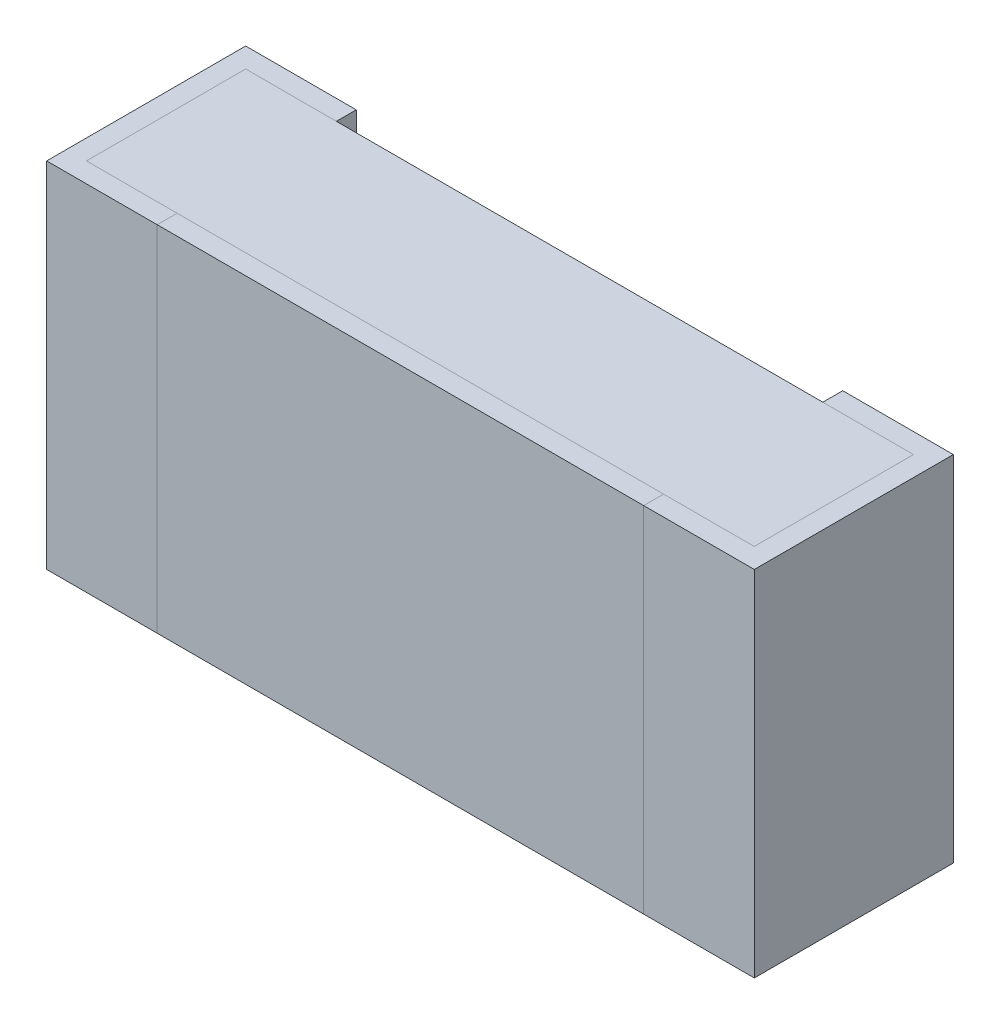
ISO-10303-21;
HEADER;
FILE_DESCRIPTION(('STEP AP214'),'2;1');
FILE_NAME('part.step','',(''),(''),'','','');
FILE_SCHEMA(('AUTOMOTIVE_DESIGN { 1 0 10303 214 1 1 1 1 }'));
ENDSEC;
DATA;
#1=APPLICATION_CONTEXT('core data for automotive mechanical design processes');
#2=APPLICATION_PROTOCOL_DEFINITION('international standard','automotive_design',2000,#1);
#3=PRODUCT_CONTEXT('',#1,'mechanical');
#4=PRODUCT('Part','Part','',(#3));
#5=PRODUCT_RELATED_PRODUCT_CATEGORY('part','',(#4));
#6=PRODUCT_DEFINITION_FORMATION('','',#4);
#7=PRODUCT_DEFINITION_CONTEXT('part definition',#1,'design');
#8=PRODUCT_DEFINITION('design','',#6,#7);
#9=PRODUCT_DEFINITION_SHAPE('','',#8);
#10=(LENGTH_UNIT() NAMED_UNIT(*) SI_UNIT(.MILLI.,.METRE.));
#11=(NAMED_UNIT(*) PLANE_ANGLE_UNIT() SI_UNIT($,.RADIAN.));
#12=(NAMED_UNIT(*) SI_UNIT($,.STERADIAN.) SOLID_ANGLE_UNIT());
#13=UNCERTAINTY_MEASURE_WITH_UNIT(LENGTH_MEASURE(1.E-05),#10,'distance_accuracy_value','');
#14=(GEOMETRIC_REPRESENTATION_CONTEXT(3) GLOBAL_UNCERTAINTY_ASSIGNED_CONTEXT((#13)) GLOBAL_UNIT_ASSIGNED_CONTEXT((#10,
#11,#12)) REPRESENTATION_CONTEXT('',''));
#15=CARTESIAN_POINT('',(0.,0.,0.));
#16=DIRECTION('',(0.,0.,1.));
#17=DIRECTION('',(1.,0.,0.));
#18=AXIS2_PLACEMENT_3D('',#15,#16,#17);
#19=CARTESIAN_POINT('',(-0.755,-0.4,0.045));
#20=DIRECTION('',(1.,0.,0.));
#21=DIRECTION('',(0.,0.,1.));
#22=AXIS2_PLACEMENT_3D('',#19,#20,#21);
#23=PLANE('',#22);
#24=DIRECTION('',(0.,1.,0.));
#25=VECTOR('',#24,1.);
#26=CARTESIAN_POINT('',(-0.755,-0.4,0.405));
#27=LINE('',#26,#25);
#28=CARTESIAN_POINT('',(-0.755,-0.4,0.405));
#29=VERTEX_POINT('',#28);
#30=CARTESIAN_POINT('',(-0.755,0.4,0.405));
#31=VERTEX_POINT('',#30);
#32=EDGE_CURVE('P0_E11',#29,#31,#27,.T.);
#33=ORIENTED_EDGE('',*,*,#32,.T.);
#34=DIRECTION('',(0.,0.,1.));
#35=VECTOR('',#34,1.);
#36=CARTESIAN_POINT('',(-0.755,0.4,0.045));
#37=LINE('',#36,#35);
#38=CARTESIAN_POINT('',(-0.755,0.4,0.045));
#39=VERTEX_POINT('',#38);
#40=EDGE_CURVE('P0_E24',#39,#31,#37,.T.);
#41=ORIENTED_EDGE('',*,*,#40,.F.);
#42=DIRECTION('',(0.,1.,0.));
#43=VECTOR('',#42,1.);
#44=CARTESIAN_POINT('',(-0.755,-0.4,0.045));
#45=LINE('',#44,#43);
#46=CARTESIAN_POINT('',(-0.755,-0.4,0.045));
#47=VERTEX_POINT('',#46);
#48=EDGE_CURVE('P0_E88',#47,#39,#45,.T.);
#49=ORIENTED_EDGE('',*,*,#48,.F.);
#50=DIRECTION('',(0.,0.,1.));
#51=VECTOR('',#50,1.);
#52=CARTESIAN_POINT('',(-0.755,-0.4,0.045));
#53=LINE('',#52,#51);
#54=EDGE_CURVE('P0_E38',#47,#29,#53,.T.);
#55=ORIENTED_EDGE('',*,*,#54,.T.);
#56=EDGE_LOOP('',(#33,#41,#49,#55));
#57=FACE_BOUND('',#56,.T.);
#58=ADVANCED_FACE('P0_F17',(#57),#23,.F.);
#59=CARTESIAN_POINT('',(0.755,-0.4,0.045));
#60=DIRECTION('',(1.,0.,0.));
#61=DIRECTION('',(0.,0.,1.));
#62=AXIS2_PLACEMENT_3D('',#59,#60,#61);
#63=PLANE('',#62);
#64=DIRECTION('',(0.,0.,1.));
#65=VECTOR('',#64,1.);
#66=CARTESIAN_POINT('',(0.755,-0.4,0.045));
#67=LINE('',#66,#65);
#68=CARTESIAN_POINT('',(0.755,-0.4,0.045));
#69=VERTEX_POINT('',#68);
#70=CARTESIAN_POINT('',(0.755,-0.4,0.405));
#71=VERTEX_POINT('',#70);
#72=EDGE_CURVE('P0_E83',#69,#71,#67,.T.);
#73=ORIENTED_EDGE('',*,*,#72,.F.);
#74=DIRECTION('',(0.,1.,0.));
#75=VECTOR('',#74,1.);
#76=CARTESIAN_POINT('',(0.755,-0.4,0.045));
#77=LINE('',#76,#75);
#78=CARTESIAN_POINT('',(0.755,0.4,0.045));
#79=VERTEX_POINT('',#78);
#80=EDGE_CURVE('P0_E64',#69,#79,#77,.T.);
#81=ORIENTED_EDGE('',*,*,#80,.T.);
#82=DIRECTION('',(0.,0.,1.));
#83=VECTOR('',#82,1.);
#84=CARTESIAN_POINT('',(0.755,0.4,0.045));
#85=LINE('',#84,#83);
#86=CARTESIAN_POINT('',(0.755,0.4,0.405));
#87=VERTEX_POINT('',#86);
#88=EDGE_CURVE('P0_E60',#79,#87,#85,.T.);
#89=ORIENTED_EDGE('',*,*,#88,.T.);
#90=DIRECTION('',(0.,1.,0.));
#91=VECTOR('',#90,1.);
#92=CARTESIAN_POINT('',(0.755,-0.4,0.405));
#93=LINE('',#92,#91);
#94=EDGE_CURVE('P0_E58',#71,#87,#93,.T.);
#95=ORIENTED_EDGE('',*,*,#94,.F.);
#96=EDGE_LOOP('',(#73,#81,#89,#95));
#97=FACE_BOUND('',#96,.T.);
#98=ADVANCED_FACE('P0_F56',(#97),#63,.T.);
#99=CARTESIAN_POINT('',(-0.755,-0.4,0.045));
#100=DIRECTION('',(0.,1.,0.));
#101=DIRECTION('',(0.,0.,1.));
#102=AXIS2_PLACEMENT_3D('',#99,#100,#101);
#103=PLANE('',#102);
#104=ORIENTED_EDGE('',*,*,#72,.T.);
#105=DIRECTION('',(1.,0.,0.));
#106=VECTOR('',#105,1.);
#107=CARTESIAN_POINT('',(-0.755,-0.4,0.405));
#108=LINE('',#107,#106);
#109=EDGE_CURVE('P0_E75',#29,#71,#108,.T.);
#110=ORIENTED_EDGE('',*,*,#109,.F.);
#111=ORIENTED_EDGE('',*,*,#54,.F.);
#112=DIRECTION('',(1.,0.,0.));
#113=VECTOR('',#112,1.);
#114=CARTESIAN_POINT('',(-0.755,-0.4,0.045));
#115=LINE('',#114,#113);
#116=EDGE_CURVE('P0_E76',#47,#69,#115,.T.);
#117=ORIENTED_EDGE('',*,*,#116,.T.);
#118=EDGE_LOOP('',(#104,#110,#111,#117));
#119=FACE_BOUND('',#118,.T.);
#120=ADVANCED_FACE('P0_F93',(#119),#103,.F.);
#121=CARTESIAN_POINT('',(-0.755,0.4,0.045));
#122=DIRECTION('',(0.,1.,0.));
#123=DIRECTION('',(0.,0.,1.));
#124=AXIS2_PLACEMENT_3D('',#121,#122,#123);
#125=PLANE('',#124);
#126=DIRECTION('',(1.,0.,0.));
#127=VECTOR('',#126,1.);
#128=CARTESIAN_POINT('',(-0.755,0.4,0.045));
#129=LINE('',#128,#127);
#130=EDGE_CURVE('P0_E72',#39,#79,#129,.T.);
#131=ORIENTED_EDGE('',*,*,#130,.F.);
#132=ORIENTED_EDGE('',*,*,#40,.T.);
#133=DIRECTION('',(1.,0.,0.));
#134=VECTOR('',#133,1.);
#135=CARTESIAN_POINT('',(-0.755,0.4,0.405));
#136=LINE('',#135,#134);
#137=EDGE_CURVE('P0_E67',#31,#87,#136,.T.);
#138=ORIENTED_EDGE('',*,*,#137,.T.);
#139=ORIENTED_EDGE('',*,*,#88,.F.);
#140=EDGE_LOOP('',(#131,#132,#138,#139));
#141=FACE_BOUND('',#140,.T.);
#142=ADVANCED_FACE('P0_F73',(#141),#125,.T.);
#143=CARTESIAN_POINT('',(-0.755,-0.4,0.045));
#144=DIRECTION('',(0.,0.,1.));
#145=DIRECTION('',(1.,0.,0.));
#146=AXIS2_PLACEMENT_3D('',#143,#144,#145);
#147=PLANE('',#146);
#148=ORIENTED_EDGE('',*,*,#130,.T.);
#149=ORIENTED_EDGE('',*,*,#80,.F.);
#150=ORIENTED_EDGE('',*,*,#116,.F.);
#151=ORIENTED_EDGE('',*,*,#48,.T.);
#152=EDGE_LOOP('',(#148,#149,#150,#151));
#153=FACE_BOUND('',#152,.T.);
#154=ADVANCED_FACE('P0_F90',(#153),#147,.F.);
#155=CARTESIAN_POINT('',(-0.755,-0.4,0.405));
#156=DIRECTION('',(0.,0.,1.));
#157=DIRECTION('',(1.,0.,0.));
#158=AXIS2_PLACEMENT_3D('',#155,#156,#157);
#159=PLANE('',#158);
#160=ORIENTED_EDGE('',*,*,#32,.F.);
#161=ORIENTED_EDGE('',*,*,#109,.T.);
#162=ORIENTED_EDGE('',*,*,#94,.T.);
#163=ORIENTED_EDGE('',*,*,#137,.F.);
#164=EDGE_LOOP('',(#160,#161,#162,#163));
#165=FACE_BOUND('',#164,.T.);
#166=ADVANCED_FACE('P0_F68',(#165),#159,.T.);
#167=CLOSED_SHELL('',(#58,#98,#120,#142,#154,#166));
#168=MANIFOLD_SOLID_BREP('P0_B1',#167);
#169=CARTESIAN_POINT('',(-0.8,-0.4,0.));
#170=DIRECTION('',(1.,0.,0.));
#171=DIRECTION('',(0.,0.,1.));
#172=AXIS2_PLACEMENT_3D('',#169,#170,#171);
#173=PLANE('',#172);
#174=DIRECTION('',(0.,1.,0.));
#175=VECTOR('',#174,1.);
#176=CARTESIAN_POINT('',(-0.8,-0.4,0.45));
#177=LINE('',#176,#175);
#178=CARTESIAN_POINT('',(-0.8,-0.4,0.45));
#179=VERTEX_POINT('',#178);
#180=CARTESIAN_POINT('',(-0.8,0.4,0.45));
#181=VERTEX_POINT('',#180);
#182=EDGE_CURVE('P1_E11',#179,#181,#177,.T.);
#183=ORIENTED_EDGE('',*,*,#182,.T.);
#184=DIRECTION('',(0.,0.,1.));
#185=VECTOR('',#184,1.);
#186=CARTESIAN_POINT('',(-0.8,0.4,0.));
#187=LINE('',#186,#185);
#188=CARTESIAN_POINT('',(-0.8,0.4,0.));
#189=VERTEX_POINT('',#188);
#190=EDGE_CURVE('P1_E24',#189,#181,#187,.T.);
#191=ORIENTED_EDGE('',*,*,#190,.F.);
#192=DIRECTION('',(0.,1.,0.));
#193=VECTOR('',#192,1.);
#194=CARTESIAN_POINT('',(-0.8,-0.4,0.));
#195=LINE('',#194,#193);
#196=CARTESIAN_POINT('',(-0.8,-0.4,0.));
#197=VERTEX_POINT('',#196);
#198=EDGE_CURVE('P1_E145',#197,#189,#195,.T.);
#199=ORIENTED_EDGE('',*,*,#198,.F.);
#200=DIRECTION('',(0.,0.,1.));
#201=VECTOR('',#200,1.);
#202=CARTESIAN_POINT('',(-0.8,-0.4,0.));
#203=LINE('',#202,#201);
#204=EDGE_CURVE('P1_E38',#197,#179,#203,.T.);
#205=ORIENTED_EDGE('',*,*,#204,.T.);
#206=EDGE_LOOP('',(#183,#191,#199,#205));
#207=FACE_BOUND('',#206,.T.);
#208=ADVANCED_FACE('P1_F17',(#207),#173,.F.);
#209=CARTESIAN_POINT('',(-0.8,-0.4,0.));
#210=DIRECTION('',(0.,1.,0.));
#211=DIRECTION('',(0.,0.,1.));
#212=AXIS2_PLACEMENT_3D('',#209,#210,#211);
#213=PLANE('',#212);
#214=DIRECTION('',(1.,0.,0.));
#215=VECTOR('',#214,1.);
#216=CARTESIAN_POINT('',(-0.755,-0.4,0.045));
#217=LINE('',#216,#215);
#218=CARTESIAN_POINT('',(-0.755,-0.4,0.045));
#219=VERTEX_POINT('',#218);
#220=CARTESIAN_POINT('',(-0.55,-0.4,0.045));
#221=VERTEX_POINT('',#220);
#222=EDGE_CURVE('P1_E143',#219,#221,#217,.T.);
#223=ORIENTED_EDGE('',*,*,#222,.F.);
#224=DIRECTION('',(0.,0.,1.));
#225=VECTOR('',#224,1.);
#226=CARTESIAN_POINT('',(-0.755,-0.4,0.045));
#227=LINE('',#226,#225);
#228=CARTESIAN_POINT('',(-0.755,-0.4,0.405));
#229=VERTEX_POINT('',#228);
#230=EDGE_CURVE('P1_E103',#219,#229,#227,.T.);
#231=ORIENTED_EDGE('',*,*,#230,.T.);
#232=DIRECTION('',(1.,0.,0.));
#233=VECTOR('',#232,1.);
#234=CARTESIAN_POINT('',(-0.755,-0.4,0.405));
#235=LINE('',#234,#233);
#236=CARTESIAN_POINT('',(-0.55,-0.4,0.405));
#237=VERTEX_POINT('',#236);
#238=EDGE_CURVE('P1_E140',#229,#237,#235,.T.);
#239=ORIENTED_EDGE('',*,*,#238,.T.);
#240=DIRECTION('',(0.,0.,1.));
#241=VECTOR('',#240,1.);
#242=CARTESIAN_POINT('',(-0.55,-0.4,0.));
#243=LINE('',#242,#241);
#244=CARTESIAN_POINT('',(-0.55,-0.4,0.45));
#245=VERTEX_POINT('',#244);
#246=EDGE_CURVE('P1_E133',#237,#245,#243,.T.);
#247=ORIENTED_EDGE('',*,*,#246,.T.);
#248=DIRECTION('',(1.,0.,0.));
#249=VECTOR('',#248,1.);
#250=CARTESIAN_POINT('',(-0.8,-0.4,0.45));
#251=LINE('',#250,#249);
#252=EDGE_CURVE('P1_E135',#179,#245,#251,.T.);
#253=ORIENTED_EDGE('',*,*,#252,.F.);
#254=ORIENTED_EDGE('',*,*,#204,.F.);
#255=DIRECTION('',(1.,0.,0.));
#256=VECTOR('',#255,1.);
#257=CARTESIAN_POINT('',(-0.8,-0.4,0.));
#258=LINE('',#257,#256);
#259=CARTESIAN_POINT('',(-0.55,-0.4,0.));
#260=VERTEX_POINT('',#259);
#261=EDGE_CURVE('P1_E127',#197,#260,#258,.T.);
#262=ORIENTED_EDGE('',*,*,#261,.T.);
#263=DIRECTION('',(0.,0.,1.));
#264=VECTOR('',#263,1.);
#265=CARTESIAN_POINT('',(-0.55,-0.4,0.));
#266=LINE('',#265,#264);
#267=EDGE_CURVE('P1_E126',#260,#221,#266,.T.);
#268=ORIENTED_EDGE('',*,*,#267,.T.);
#269=EDGE_LOOP('',(#223,#231,#239,#247,#253,#254,#262,#268));
#270=FACE_BOUND('',#269,.T.);
#271=ADVANCED_FACE('P1_F153',(#270),#213,.F.);
#272=CARTESIAN_POINT('',(-0.8,-0.4,0.45));
#273=DIRECTION('',(0.,0.,1.));
#274=DIRECTION('',(1.,0.,0.));
#275=AXIS2_PLACEMENT_3D('',#272,#273,#274);
#276=PLANE('',#275);
#277=ORIENTED_EDGE('',*,*,#182,.F.);
#278=ORIENTED_EDGE('',*,*,#252,.T.);
#279=DIRECTION('',(0.,1.,0.));
#280=VECTOR('',#279,1.);
#281=CARTESIAN_POINT('',(-0.55,-0.4,0.45));
#282=LINE('',#281,#280);
#283=CARTESIAN_POINT('',(-0.55,0.4,0.45));
#284=VERTEX_POINT('',#283);
#285=EDGE_CURVE('P1_E124',#245,#284,#282,.T.);
#286=ORIENTED_EDGE('',*,*,#285,.T.);
#287=DIRECTION('',(1.,0.,0.));
#288=VECTOR('',#287,1.);
#289=CARTESIAN_POINT('',(-0.8,0.4,0.45));
#290=LINE('',#289,#288);
#291=EDGE_CURVE('P1_E123',#181,#284,#290,.T.);
#292=ORIENTED_EDGE('',*,*,#291,.F.);
#293=EDGE_LOOP('',(#277,#278,#286,#292));
#294=FACE_BOUND('',#293,.T.);
#295=ADVANCED_FACE('P1_F160',(#294),#276,.T.);
#296=CARTESIAN_POINT('',(-0.8,0.4,0.));
#297=DIRECTION('',(0.,1.,0.));
#298=DIRECTION('',(0.,0.,1.));
#299=AXIS2_PLACEMENT_3D('',#296,#297,#298);
#300=PLANE('',#299);
#301=DIRECTION('',(0.,0.,1.));
#302=VECTOR('',#301,1.);
#303=CARTESIAN_POINT('',(-0.55,0.4,0.));
#304=LINE('',#303,#302);
#305=CARTESIAN_POINT('',(-0.55,0.4,0.));
#306=VERTEX_POINT('',#305);
#307=CARTESIAN_POINT('',(-0.55,0.4,0.045));
#308=VERTEX_POINT('',#307);
#309=EDGE_CURVE('P1_E121',#306,#308,#304,.T.);
#310=ORIENTED_EDGE('',*,*,#309,.F.);
#311=DIRECTION('',(1.,0.,0.));
#312=VECTOR('',#311,1.);
#313=CARTESIAN_POINT('',(-0.8,0.4,0.));
#314=LINE('',#313,#312);
#315=EDGE_CURVE('P1_E119',#189,#306,#314,.T.);
#316=ORIENTED_EDGE('',*,*,#315,.F.);
#317=ORIENTED_EDGE('',*,*,#190,.T.);
#318=ORIENTED_EDGE('',*,*,#291,.T.);
#319=DIRECTION('',(0.,0.,1.));
#320=VECTOR('',#319,1.);
#321=CARTESIAN_POINT('',(-0.55,0.4,0.));
#322=LINE('',#321,#320);
#323=CARTESIAN_POINT('',(-0.55,0.4,0.405));
#324=VERTEX_POINT('',#323);
#325=EDGE_CURVE('P1_E113',#324,#284,#322,.T.);
#326=ORIENTED_EDGE('',*,*,#325,.F.);
#327=DIRECTION('',(1.,0.,0.));
#328=VECTOR('',#327,1.);
#329=CARTESIAN_POINT('',(-0.755,0.4,0.405));
#330=LINE('',#329,#328);
#331=CARTESIAN_POINT('',(-0.755,0.4,0.405));
#332=VERTEX_POINT('',#331);
#333=EDGE_CURVE('P1_E96',#332,#324,#330,.T.);
#334=ORIENTED_EDGE('',*,*,#333,.F.);
#335=DIRECTION('',(0.,0.,1.));
#336=VECTOR('',#335,1.);
#337=CARTESIAN_POINT('',(-0.755,0.4,0.045));
#338=LINE('',#337,#336);
#339=CARTESIAN_POINT('',(-0.755,0.4,0.045));
#340=VERTEX_POINT('',#339);
#341=EDGE_CURVE('P1_E89',#340,#332,#338,.T.);
#342=ORIENTED_EDGE('',*,*,#341,.F.);
#343=DIRECTION('',(1.,0.,0.));
#344=VECTOR('',#343,1.);
#345=CARTESIAN_POINT('',(-0.755,0.4,0.045));
#346=LINE('',#345,#344);
#347=EDGE_CURVE('P1_E85',#340,#308,#346,.T.);
#348=ORIENTED_EDGE('',*,*,#347,.T.);
#349=EDGE_LOOP('',(#310,#316,#317,#318,#326,#334,#342,#348));
#350=FACE_BOUND('',#349,.T.);
#351=ADVANCED_FACE('P1_F94',(#350),#300,.T.);
#352=CARTESIAN_POINT('',(-0.8,-0.4,0.));
#353=DIRECTION('',(0.,0.,1.));
#354=DIRECTION('',(1.,0.,0.));
#355=AXIS2_PLACEMENT_3D('',#352,#353,#354);
#356=PLANE('',#355);
#357=ORIENTED_EDGE('',*,*,#315,.T.);
#358=DIRECTION('',(0.,1.,0.));
#359=VECTOR('',#358,1.);
#360=CARTESIAN_POINT('',(-0.55,-0.4,0.));
#361=LINE('',#360,#359);
#362=EDGE_CURVE('P1_E93',#260,#306,#361,.T.);
#363=ORIENTED_EDGE('',*,*,#362,.F.);
#364=ORIENTED_EDGE('',*,*,#261,.F.);
#365=ORIENTED_EDGE('',*,*,#198,.T.);
#366=EDGE_LOOP('',(#357,#363,#364,#365));
#367=FACE_BOUND('',#366,.T.);
#368=ADVANCED_FACE('P1_F150',(#367),#356,.F.);
#369=CARTESIAN_POINT('',(-0.55,-0.4,0.));
#370=DIRECTION('',(1.,0.,0.));
#371=DIRECTION('',(0.,0.,1.));
#372=AXIS2_PLACEMENT_3D('',#369,#370,#371);
#373=PLANE('',#372);
#374=ORIENTED_EDGE('',*,*,#267,.F.);
#375=ORIENTED_EDGE('',*,*,#362,.T.);
#376=ORIENTED_EDGE('',*,*,#309,.T.);
#377=DIRECTION('',(0.,-1.,0.));
#378=VECTOR('',#377,1.);
#379=CARTESIAN_POINT('',(-0.55,-0.4,0.045));
#380=LINE('',#379,#378);
#381=EDGE_CURVE('P1_E90',#308,#221,#380,.T.);
#382=ORIENTED_EDGE('',*,*,#381,.T.);
#383=EDGE_LOOP('',(#374,#375,#376,#382));
#384=FACE_BOUND('',#383,.T.);
#385=ADVANCED_FACE('P1_F151',(#384),#373,.T.);
#386=CARTESIAN_POINT('',(-0.755,-0.4,0.045));
#387=DIRECTION('',(0.,0.,1.));
#388=DIRECTION('',(1.,0.,0.));
#389=AXIS2_PLACEMENT_3D('',#386,#387,#388);
#390=PLANE('',#389);
#391=ORIENTED_EDGE('',*,*,#347,.F.);
#392=DIRECTION('',(0.,1.,0.));
#393=VECTOR('',#392,1.);
#394=CARTESIAN_POINT('',(-0.755,-0.4,0.045));
#395=LINE('',#394,#393);
#396=EDGE_CURVE('P1_E87',#219,#340,#395,.T.);
#397=ORIENTED_EDGE('',*,*,#396,.F.);
#398=ORIENTED_EDGE('',*,*,#222,.T.);
#399=ORIENTED_EDGE('',*,*,#381,.F.);
#400=EDGE_LOOP('',(#391,#397,#398,#399));
#401=FACE_BOUND('',#400,.T.);
#402=ADVANCED_FACE('P1_F82',(#401),#390,.T.);
#403=CARTESIAN_POINT('',(-0.755,-0.4,0.045));
#404=DIRECTION('',(1.,0.,0.));
#405=DIRECTION('',(0.,0.,1.));
#406=AXIS2_PLACEMENT_3D('',#403,#404,#405);
#407=PLANE('',#406);
#408=ORIENTED_EDGE('',*,*,#230,.F.);
#409=ORIENTED_EDGE('',*,*,#396,.T.);
#410=ORIENTED_EDGE('',*,*,#341,.T.);
#411=DIRECTION('',(0.,1.,0.));
#412=VECTOR('',#411,1.);
#413=CARTESIAN_POINT('',(-0.755,-0.4,0.405));
#414=LINE('',#413,#412);
#415=EDGE_CURVE('P1_E104',#229,#332,#414,.T.);
#416=ORIENTED_EDGE('',*,*,#415,.F.);
#417=EDGE_LOOP('',(#408,#409,#410,#416));
#418=FACE_BOUND('',#417,.T.);
#419=ADVANCED_FACE('P1_F101',(#418),#407,.T.);
#420=CARTESIAN_POINT('',(-0.755,-0.4,0.405));
#421=DIRECTION('',(0.,0.,1.));
#422=DIRECTION('',(1.,0.,0.));
#423=AXIS2_PLACEMENT_3D('',#420,#421,#422);
#424=PLANE('',#423);
#425=DIRECTION('',(0.,-1.,0.));
#426=VECTOR('',#425,1.);
#427=CARTESIAN_POINT('',(-0.55,-0.4,0.405));
#428=LINE('',#427,#426);
#429=EDGE_CURVE('P1_E107',#324,#237,#428,.T.);
#430=ORIENTED_EDGE('',*,*,#429,.T.);
#431=ORIENTED_EDGE('',*,*,#238,.F.);
#432=ORIENTED_EDGE('',*,*,#415,.T.);
#433=ORIENTED_EDGE('',*,*,#333,.T.);
#434=EDGE_LOOP('',(#430,#431,#432,#433));
#435=FACE_BOUND('',#434,.T.);
#436=ADVANCED_FACE('P1_F162',(#435),#424,.F.);
#437=CARTESIAN_POINT('',(-0.55,-0.4,0.));
#438=DIRECTION('',(1.,0.,0.));
#439=DIRECTION('',(0.,0.,1.));
#440=AXIS2_PLACEMENT_3D('',#437,#438,#439);
#441=PLANE('',#440);
#442=ORIENTED_EDGE('',*,*,#246,.F.);
#443=ORIENTED_EDGE('',*,*,#429,.F.);
#444=ORIENTED_EDGE('',*,*,#325,.T.);
#445=ORIENTED_EDGE('',*,*,#285,.F.);
#446=EDGE_LOOP('',(#442,#443,#444,#445));
#447=FACE_BOUND('',#446,.T.);
#448=ADVANCED_FACE('P1_F159',(#447),#441,.T.);
#449=CLOSED_SHELL('',(#208,#271,#295,#351,#368,#385,#402,#419,#436,#448));
#450=MANIFOLD_SOLID_BREP('P1_B1',#449);
#451=CARTESIAN_POINT('',(0.8,0.4,0.));
#452=DIRECTION('',(-1.,0.,0.));
#453=DIRECTION('',(0.,0.,1.));
#454=AXIS2_PLACEMENT_3D('',#451,#452,#453);
#455=PLANE('',#454);
#456=DIRECTION('',(0.,-1.,0.));
#457=VECTOR('',#456,1.);
#458=CARTESIAN_POINT('',(0.8,0.4,0.45));
#459=LINE('',#458,#457);
#460=CARTESIAN_POINT('',(0.8,0.4,0.45));
#461=VERTEX_POINT('',#460);
#462=CARTESIAN_POINT('',(0.8,-0.4,0.45));
#463=VERTEX_POINT('',#462);
#464=EDGE_CURVE('P2_E11',#461,#463,#459,.T.);
#465=ORIENTED_EDGE('',*,*,#464,.T.);
#466=DIRECTION('',(0.,0.,1.));
#467=VECTOR('',#466,1.);
#468=CARTESIAN_POINT('',(0.8,-0.4,0.));
#469=LINE('',#468,#467);
#470=CARTESIAN_POINT('',(0.8,-0.4,0.));
#471=VERTEX_POINT('',#470);
#472=EDGE_CURVE('P2_E24',#471,#463,#469,.T.);
#473=ORIENTED_EDGE('',*,*,#472,.F.);
#474=DIRECTION('',(0.,-1.,0.));
#475=VECTOR('',#474,1.);
#476=CARTESIAN_POINT('',(0.8,0.4,0.));
#477=LINE('',#476,#475);
#478=CARTESIAN_POINT('',(0.8,0.4,0.));
#479=VERTEX_POINT('',#478);
#480=EDGE_CURVE('P2_E145',#479,#471,#477,.T.);
#481=ORIENTED_EDGE('',*,*,#480,.F.);
#482=DIRECTION('',(0.,0.,1.));
#483=VECTOR('',#482,1.);
#484=CARTESIAN_POINT('',(0.8,0.4,0.));
#485=LINE('',#484,#483);
#486=EDGE_CURVE('P2_E38',#479,#461,#485,.T.);
#487=ORIENTED_EDGE('',*,*,#486,.T.);
#488=EDGE_LOOP('',(#465,#473,#481,#487));
#489=FACE_BOUND('',#488,.T.);
#490=ADVANCED_FACE('P2_F17',(#489),#455,.F.);
#491=CARTESIAN_POINT('',(0.8,0.4,0.));
#492=DIRECTION('',(0.,-1.,0.));
#493=DIRECTION('',(0.,0.,1.));
#494=AXIS2_PLACEMENT_3D('',#491,#492,#493);
#495=PLANE('',#494);
#496=DIRECTION('',(-1.,0.,0.));
#497=VECTOR('',#496,1.);
#498=CARTESIAN_POINT('',(0.755,0.4,0.045));
#499=LINE('',#498,#497);
#500=CARTESIAN_POINT('',(0.755,0.4,0.045));
#501=VERTEX_POINT('',#500);
#502=CARTESIAN_POINT('',(0.55,0.4,0.045));
#503=VERTEX_POINT('',#502);
#504=EDGE_CURVE('P2_E143',#501,#503,#499,.T.);
#505=ORIENTED_EDGE('',*,*,#504,.F.);
#506=DIRECTION('',(0.,0.,1.));
#507=VECTOR('',#506,1.);
#508=CARTESIAN_POINT('',(0.755,0.4,0.045));
#509=LINE('',#508,#507);
#510=CARTESIAN_POINT('',(0.755,0.4,0.405));
#511=VERTEX_POINT('',#510);
#512=EDGE_CURVE('P2_E105',#501,#511,#509,.T.);
#513=ORIENTED_EDGE('',*,*,#512,.T.);
#514=DIRECTION('',(-1.,0.,0.));
#515=VECTOR('',#514,1.);
#516=CARTESIAN_POINT('',(0.755,0.4,0.405));
#517=LINE('',#516,#515);
#518=CARTESIAN_POINT('',(0.55,0.4,0.405));
#519=VERTEX_POINT('',#518);
#520=EDGE_CURVE('P2_E140',#511,#519,#517,.T.);
#521=ORIENTED_EDGE('',*,*,#520,.T.);
#522=DIRECTION('',(0.,0.,1.));
#523=VECTOR('',#522,1.);
#524=CARTESIAN_POINT('',(0.55,0.4,0.));
#525=LINE('',#524,#523);
#526=CARTESIAN_POINT('',(0.55,0.4,0.45));
#527=VERTEX_POINT('',#526);
#528=EDGE_CURVE('P2_E133',#519,#527,#525,.T.);
#529=ORIENTED_EDGE('',*,*,#528,.T.);
#530=DIRECTION('',(-1.,0.,0.));
#531=VECTOR('',#530,1.);
#532=CARTESIAN_POINT('',(0.8,0.4,0.45));
#533=LINE('',#532,#531);
#534=EDGE_CURVE('P2_E135',#461,#527,#533,.T.);
#535=ORIENTED_EDGE('',*,*,#534,.F.);
#536=ORIENTED_EDGE('',*,*,#486,.F.);
#537=DIRECTION('',(-1.,0.,0.));
#538=VECTOR('',#537,1.);
#539=CARTESIAN_POINT('',(0.8,0.4,0.));
#540=LINE('',#539,#538);
#541=CARTESIAN_POINT('',(0.55,0.4,0.));
#542=VERTEX_POINT('',#541);
#543=EDGE_CURVE('P2_E127',#479,#542,#540,.T.);
#544=ORIENTED_EDGE('',*,*,#543,.T.);
#545=DIRECTION('',(0.,0.,1.));
#546=VECTOR('',#545,1.);
#547=CARTESIAN_POINT('',(0.55,0.4,0.));
#548=LINE('',#547,#546);
#549=EDGE_CURVE('P2_E126',#542,#503,#548,.T.);
#550=ORIENTED_EDGE('',*,*,#549,.T.);
#551=EDGE_LOOP('',(#505,#513,#521,#529,#535,#536,#544,#550));
#552=FACE_BOUND('',#551,.T.);
#553=ADVANCED_FACE('P2_F153',(#552),#495,.F.);
#554=CARTESIAN_POINT('',(0.8,0.4,0.45));
#555=DIRECTION('',(0.,0.,1.));
#556=DIRECTION('',(-1.,0.,0.));
#557=AXIS2_PLACEMENT_3D('',#554,#555,#556);
#558=PLANE('',#557);
#559=ORIENTED_EDGE('',*,*,#464,.F.);
#560=ORIENTED_EDGE('',*,*,#534,.T.);
#561=DIRECTION('',(0.,-1.,0.));
#562=VECTOR('',#561,1.);
#563=CARTESIAN_POINT('',(0.55,0.4,0.45));
#564=LINE('',#563,#562);
#565=CARTESIAN_POINT('',(0.55,-0.4,0.45));
#566=VERTEX_POINT('',#565);
#567=EDGE_CURVE('P2_E122',#527,#566,#564,.T.);
#568=ORIENTED_EDGE('',*,*,#567,.T.);
#569=DIRECTION('',(-1.,0.,0.));
#570=VECTOR('',#569,1.);
#571=CARTESIAN_POINT('',(0.8,-0.4,0.45));
#572=LINE('',#571,#570);
#573=EDGE_CURVE('P2_E125',#463,#566,#572,.T.);
#574=ORIENTED_EDGE('',*,*,#573,.F.);
#575=EDGE_LOOP('',(#559,#560,#568,#574));
#576=FACE_BOUND('',#575,.T.);
#577=ADVANCED_FACE('P2_F160',(#576),#558,.T.);
#578=CARTESIAN_POINT('',(0.8,-0.4,0.));
#579=DIRECTION('',(0.,-1.,0.));
#580=DIRECTION('',(0.,0.,1.));
#581=AXIS2_PLACEMENT_3D('',#578,#579,#580);
#582=PLANE('',#581);
#583=DIRECTION('',(0.,0.,1.));
#584=VECTOR('',#583,1.);
#585=CARTESIAN_POINT('',(0.55,-0.4,0.));
#586=LINE('',#585,#584);
#587=CARTESIAN_POINT('',(0.55,-0.4,0.));
#588=VERTEX_POINT('',#587);
#589=CARTESIAN_POINT('',(0.55,-0.4,0.045));
#590=VERTEX_POINT('',#589);
#591=EDGE_CURVE('P2_E120',#588,#590,#586,.T.);
#592=ORIENTED_EDGE('',*,*,#591,.F.);
#593=DIRECTION('',(-1.,0.,0.));
#594=VECTOR('',#593,1.);
#595=CARTESIAN_POINT('',(0.8,-0.4,0.));
#596=LINE('',#595,#594);
#597=EDGE_CURVE('P2_E117',#471,#588,#596,.T.);
#598=ORIENTED_EDGE('',*,*,#597,.F.);
#599=ORIENTED_EDGE('',*,*,#472,.T.);
#600=ORIENTED_EDGE('',*,*,#573,.T.);
#601=DIRECTION('',(0.,0.,1.));
#602=VECTOR('',#601,1.);
#603=CARTESIAN_POINT('',(0.55,-0.4,0.));
#604=LINE('',#603,#602);
#605=CARTESIAN_POINT('',(0.55,-0.4,0.405));
#606=VERTEX_POINT('',#605);
#607=EDGE_CURVE('P2_E111',#606,#566,#604,.T.);
#608=ORIENTED_EDGE('',*,*,#607,.F.);
#609=DIRECTION('',(-1.,0.,0.));
#610=VECTOR('',#609,1.);
#611=CARTESIAN_POINT('',(0.755,-0.4,0.405));
#612=LINE('',#611,#610);
#613=CARTESIAN_POINT('',(0.755,-0.4,0.405));
#614=VERTEX_POINT('',#613);
#615=EDGE_CURVE('P2_E92',#614,#606,#612,.T.);
#616=ORIENTED_EDGE('',*,*,#615,.F.);
#617=DIRECTION('',(0.,0.,1.));
#618=VECTOR('',#617,1.);
#619=CARTESIAN_POINT('',(0.755,-0.4,0.045));
#620=LINE('',#619,#618);
#621=CARTESIAN_POINT('',(0.755,-0.4,0.045));
#622=VERTEX_POINT('',#621);
#623=EDGE_CURVE('P2_E90',#622,#614,#620,.T.);
#624=ORIENTED_EDGE('',*,*,#623,.F.);
#625=DIRECTION('',(-1.,0.,0.));
#626=VECTOR('',#625,1.);
#627=CARTESIAN_POINT('',(0.755,-0.4,0.045));
#628=LINE('',#627,#626);
#629=EDGE_CURVE('P2_E81',#622,#590,#628,.T.);
#630=ORIENTED_EDGE('',*,*,#629,.T.);
#631=EDGE_LOOP('',(#592,#598,#599,#600,#608,#616,#624,#630));
#632=FACE_BOUND('',#631,.T.);
#633=ADVANCED_FACE('P2_F91',(#632),#582,.T.);
#634=CARTESIAN_POINT('',(0.8,0.4,0.));
#635=DIRECTION('',(0.,0.,1.));
#636=DIRECTION('',(-1.,0.,0.));
#637=AXIS2_PLACEMENT_3D('',#634,#635,#636);
#638=PLANE('',#637);
#639=ORIENTED_EDGE('',*,*,#597,.T.);
#640=DIRECTION('',(0.,-1.,0.));
#641=VECTOR('',#640,1.);
#642=CARTESIAN_POINT('',(0.55,0.4,0.));
#643=LINE('',#642,#641);
#644=EDGE_CURVE('P2_E89',#542,#588,#643,.T.);
#645=ORIENTED_EDGE('',*,*,#644,.F.);
#646=ORIENTED_EDGE('',*,*,#543,.F.);
#647=ORIENTED_EDGE('',*,*,#480,.T.);
#648=EDGE_LOOP('',(#639,#645,#646,#647));
#649=FACE_BOUND('',#648,.T.);
#650=ADVANCED_FACE('P2_F150',(#649),#638,.F.);
#651=CARTESIAN_POINT('',(0.55,0.4,0.));
#652=DIRECTION('',(-1.,0.,0.));
#653=DIRECTION('',(0.,0.,1.));
#654=AXIS2_PLACEMENT_3D('',#651,#652,#653);
#655=PLANE('',#654);
#656=ORIENTED_EDGE('',*,*,#549,.F.);
#657=ORIENTED_EDGE('',*,*,#644,.T.);
#658=ORIENTED_EDGE('',*,*,#591,.T.);
#659=DIRECTION('',(0.,1.,0.));
#660=VECTOR('',#659,1.);
#661=CARTESIAN_POINT('',(0.55,0.4,0.045));
#662=LINE('',#661,#660);
#663=EDGE_CURVE('P2_E86',#590,#503,#662,.T.);
#664=ORIENTED_EDGE('',*,*,#663,.T.);
#665=EDGE_LOOP('',(#656,#657,#658,#664));
#666=FACE_BOUND('',#665,.T.);
#667=ADVANCED_FACE('P2_F151',(#666),#655,.T.);
#668=CARTESIAN_POINT('',(0.755,0.4,0.045));
#669=DIRECTION('',(0.,0.,1.));
#670=DIRECTION('',(-1.,0.,0.));
#671=AXIS2_PLACEMENT_3D('',#668,#669,#670);
#672=PLANE('',#671);
#673=ORIENTED_EDGE('',*,*,#629,.F.);
#674=DIRECTION('',(0.,-1.,0.));
#675=VECTOR('',#674,1.);
#676=CARTESIAN_POINT('',(0.755,0.4,0.045));
#677=LINE('',#676,#675);
#678=EDGE_CURVE('P2_E88',#501,#622,#677,.T.);
#679=ORIENTED_EDGE('',*,*,#678,.F.);
#680=ORIENTED_EDGE('',*,*,#504,.T.);
#681=ORIENTED_EDGE('',*,*,#663,.F.);
#682=EDGE_LOOP('',(#673,#679,#680,#681));
#683=FACE_BOUND('',#682,.T.);
#684=ADVANCED_FACE('P2_F83',(#683),#672,.T.);
#685=CARTESIAN_POINT('',(0.755,0.4,0.045));
#686=DIRECTION('',(-1.,0.,0.));
#687=DIRECTION('',(0.,0.,1.));
#688=AXIS2_PLACEMENT_3D('',#685,#686,#687);
#689=PLANE('',#688);
#690=ORIENTED_EDGE('',*,*,#512,.F.);
#691=ORIENTED_EDGE('',*,*,#678,.T.);
#692=ORIENTED_EDGE('',*,*,#623,.T.);
#693=DIRECTION('',(0.,-1.,0.));
#694=VECTOR('',#693,1.);
#695=CARTESIAN_POINT('',(0.755,0.4,0.405));
#696=LINE('',#695,#694);
#697=EDGE_CURVE('P2_E102',#511,#614,#696,.T.);
#698=ORIENTED_EDGE('',*,*,#697,.F.);
#699=EDGE_LOOP('',(#690,#691,#692,#698));
#700=FACE_BOUND('',#699,.T.);
#701=ADVANCED_FACE('P2_F99',(#700),#689,.T.);
#702=CARTESIAN_POINT('',(0.755,0.4,0.405));
#703=DIRECTION('',(0.,0.,1.));
#704=DIRECTION('',(-1.,0.,0.));
#705=AXIS2_PLACEMENT_3D('',#702,#703,#704);
#706=PLANE('',#705);
#707=DIRECTION('',(0.,1.,0.));
#708=VECTOR('',#707,1.);
#709=CARTESIAN_POINT('',(0.55,0.4,0.405));
#710=LINE('',#709,#708);
#711=EDGE_CURVE('P2_E110',#606,#519,#710,.T.);
#712=ORIENTED_EDGE('',*,*,#711,.T.);
#713=ORIENTED_EDGE('',*,*,#520,.F.);
#714=ORIENTED_EDGE('',*,*,#697,.T.);
#715=ORIENTED_EDGE('',*,*,#615,.T.);
#716=EDGE_LOOP('',(#712,#713,#714,#715));
#717=FACE_BOUND('',#716,.T.);
#718=ADVANCED_FACE('P2_F162',(#717),#706,.F.);
#719=CARTESIAN_POINT('',(0.55,0.4,0.));
#720=DIRECTION('',(-1.,0.,0.));
#721=DIRECTION('',(0.,0.,1.));
#722=AXIS2_PLACEMENT_3D('',#719,#720,#721);
#723=PLANE('',#722);
#724=ORIENTED_EDGE('',*,*,#528,.F.);
#725=ORIENTED_EDGE('',*,*,#711,.F.);
#726=ORIENTED_EDGE('',*,*,#607,.T.);
#727=ORIENTED_EDGE('',*,*,#567,.F.);
#728=EDGE_LOOP('',(#724,#725,#726,#727));
#729=FACE_BOUND('',#728,.T.);
#730=ADVANCED_FACE('P2_F159',(#729),#723,.T.);
#731=CLOSED_SHELL('',(#490,#553,#577,#633,#650,#667,#684,#701,#718,#730));
#732=MANIFOLD_SOLID_BREP('P2_B1',#731);
#733=CARTESIAN_POINT('',(-0.55,-0.4,0.405));
#734=DIRECTION('',(1.,0.,0.));
#735=DIRECTION('',(0.,0.,1.));
#736=AXIS2_PLACEMENT_3D('',#733,#734,#735);
#737=PLANE('',#736);
#738=DIRECTION('',(0.,1.,0.));
#739=VECTOR('',#738,1.);
#740=CARTESIAN_POINT('',(-0.55,-0.4,0.45));
#741=LINE('',#740,#739);
#742=CARTESIAN_POINT('',(-0.55,-0.4,0.45));
#743=VERTEX_POINT('',#742);
#744=CARTESIAN_POINT('',(-0.55,0.4,0.45));
#745=VERTEX_POINT('',#744);
#746=EDGE_CURVE('P3_E11',#743,#745,#741,.T.);
#747=ORIENTED_EDGE('',*,*,#746,.T.);
#748=DIRECTION('',(0.,0.,1.));
#749=VECTOR('',#748,1.);
#750=CARTESIAN_POINT('',(-0.55,0.4,0.405));
#751=LINE('',#750,#749);
#752=CARTESIAN_POINT('',(-0.55,0.4,0.405));
#753=VERTEX_POINT('',#752);
#754=EDGE_CURVE('P3_E24',#753,#745,#751,.T.);
#755=ORIENTED_EDGE('',*,*,#754,.F.);
#756=DIRECTION('',(0.,1.,0.));
#757=VECTOR('',#756,1.);
#758=CARTESIAN_POINT('',(-0.55,-0.4,0.405));
#759=LINE('',#758,#757);
#760=CARTESIAN_POINT('',(-0.55,-0.4,0.405));
#761=VERTEX_POINT('',#760);
#762=EDGE_CURVE('P3_E88',#761,#753,#759,.T.);
#763=ORIENTED_EDGE('',*,*,#762,.F.);
#764=DIRECTION('',(0.,0.,1.));
#765=VECTOR('',#764,1.);
#766=CARTESIAN_POINT('',(-0.55,-0.4,0.405));
#767=LINE('',#766,#765);
#768=EDGE_CURVE('P3_E38',#761,#743,#767,.T.);
#769=ORIENTED_EDGE('',*,*,#768,.T.);
#770=EDGE_LOOP('',(#747,#755,#763,#769));
#771=FACE_BOUND('',#770,.T.);
#772=ADVANCED_FACE('P3_F17',(#771),#737,.F.);
#773=CARTESIAN_POINT('',(0.55,-0.4,0.405));
#774=DIRECTION('',(1.,0.,0.));
#775=DIRECTION('',(0.,0.,1.));
#776=AXIS2_PLACEMENT_3D('',#773,#774,#775);
#777=PLANE('',#776);
#778=DIRECTION('',(0.,0.,1.));
#779=VECTOR('',#778,1.);
#780=CARTESIAN_POINT('',(0.55,-0.4,0.405));
#781=LINE('',#780,#779);
#782=CARTESIAN_POINT('',(0.55,-0.4,0.405));
#783=VERTEX_POINT('',#782);
#784=CARTESIAN_POINT('',(0.55,-0.4,0.45));
#785=VERTEX_POINT('',#784);
#786=EDGE_CURVE('P3_E83',#783,#785,#781,.T.);
#787=ORIENTED_EDGE('',*,*,#786,.F.);
#788=DIRECTION('',(0.,1.,0.));
#789=VECTOR('',#788,1.);
#790=CARTESIAN_POINT('',(0.55,-0.4,0.405));
#791=LINE('',#790,#789);
#792=CARTESIAN_POINT('',(0.55,0.4,0.405));
#793=VERTEX_POINT('',#792);
#794=EDGE_CURVE('P3_E64',#783,#793,#791,.T.);
#795=ORIENTED_EDGE('',*,*,#794,.T.);
#796=DIRECTION('',(0.,0.,1.));
#797=VECTOR('',#796,1.);
#798=CARTESIAN_POINT('',(0.55,0.4,0.405));
#799=LINE('',#798,#797);
#800=CARTESIAN_POINT('',(0.55,0.4,0.45));
#801=VERTEX_POINT('',#800);
#802=EDGE_CURVE('P3_E60',#793,#801,#799,.T.);
#803=ORIENTED_EDGE('',*,*,#802,.T.);
#804=DIRECTION('',(0.,1.,0.));
#805=VECTOR('',#804,1.);
#806=CARTESIAN_POINT('',(0.55,-0.4,0.45));
#807=LINE('',#806,#805);
#808=EDGE_CURVE('P3_E58',#785,#801,#807,.T.);
#809=ORIENTED_EDGE('',*,*,#808,.F.);
#810=EDGE_LOOP('',(#787,#795,#803,#809));
#811=FACE_BOUND('',#810,.T.);
#812=ADVANCED_FACE('P3_F56',(#811),#777,.T.);
#813=CARTESIAN_POINT('',(-0.55,-0.4,0.405));
#814=DIRECTION('',(0.,1.,0.));
#815=DIRECTION('',(0.,0.,1.));
#816=AXIS2_PLACEMENT_3D('',#813,#814,#815);
#817=PLANE('',#816);
#818=ORIENTED_EDGE('',*,*,#786,.T.);
#819=DIRECTION('',(1.,0.,0.));
#820=VECTOR('',#819,1.);
#821=CARTESIAN_POINT('',(-0.55,-0.4,0.45));
#822=LINE('',#821,#820);
#823=EDGE_CURVE('P3_E75',#743,#785,#822,.T.);
#824=ORIENTED_EDGE('',*,*,#823,.F.);
#825=ORIENTED_EDGE('',*,*,#768,.F.);
#826=DIRECTION('',(1.,0.,0.));
#827=VECTOR('',#826,1.);
#828=CARTESIAN_POINT('',(-0.55,-0.4,0.405));
#829=LINE('',#828,#827);
#830=EDGE_CURVE('P3_E76',#761,#783,#829,.T.);
#831=ORIENTED_EDGE('',*,*,#830,.T.);
#832=EDGE_LOOP('',(#818,#824,#825,#831));
#833=FACE_BOUND('',#832,.T.);
#834=ADVANCED_FACE('P3_F93',(#833),#817,.F.);
#835=CARTESIAN_POINT('',(-0.55,0.4,0.405));
#836=DIRECTION('',(0.,1.,0.));
#837=DIRECTION('',(0.,0.,1.));
#838=AXIS2_PLACEMENT_3D('',#835,#836,#837);
#839=PLANE('',#838);
#840=DIRECTION('',(1.,0.,0.));
#841=VECTOR('',#840,1.);
#842=CARTESIAN_POINT('',(-0.55,0.4,0.405));
#843=LINE('',#842,#841);
#844=EDGE_CURVE('P3_E72',#753,#793,#843,.T.);
#845=ORIENTED_EDGE('',*,*,#844,.F.);
#846=ORIENTED_EDGE('',*,*,#754,.T.);
#847=DIRECTION('',(1.,0.,0.));
#848=VECTOR('',#847,1.);
#849=CARTESIAN_POINT('',(-0.55,0.4,0.45));
#850=LINE('',#849,#848);
#851=EDGE_CURVE('P3_E67',#745,#801,#850,.T.);
#852=ORIENTED_EDGE('',*,*,#851,.T.);
#853=ORIENTED_EDGE('',*,*,#802,.F.);
#854=EDGE_LOOP('',(#845,#846,#852,#853));
#855=FACE_BOUND('',#854,.T.);
#856=ADVANCED_FACE('P3_F73',(#855),#839,.T.);
#857=CARTESIAN_POINT('',(-0.55,-0.4,0.405));
#858=DIRECTION('',(0.,0.,1.));
#859=DIRECTION('',(1.,0.,0.));
#860=AXIS2_PLACEMENT_3D('',#857,#858,#859);
#861=PLANE('',#860);
#862=ORIENTED_EDGE('',*,*,#844,.T.);
#863=ORIENTED_EDGE('',*,*,#794,.F.);
#864=ORIENTED_EDGE('',*,*,#830,.F.);
#865=ORIENTED_EDGE('',*,*,#762,.T.);
#866=EDGE_LOOP('',(#862,#863,#864,#865));
#867=FACE_BOUND('',#866,.T.);
#868=ADVANCED_FACE('P3_F90',(#867),#861,.F.);
#869=CARTESIAN_POINT('',(-0.55,-0.4,0.45));
#870=DIRECTION('',(0.,0.,1.));
#871=DIRECTION('',(1.,0.,0.));
#872=AXIS2_PLACEMENT_3D('',#869,#870,#871);
#873=PLANE('',#872);
#874=ORIENTED_EDGE('',*,*,#746,.F.);
#875=ORIENTED_EDGE('',*,*,#823,.T.);
#876=ORIENTED_EDGE('',*,*,#808,.T.);
#877=ORIENTED_EDGE('',*,*,#851,.F.);
#878=EDGE_LOOP('',(#874,#875,#876,#877));
#879=FACE_BOUND('',#878,.T.);
#880=ADVANCED_FACE('P3_F68',(#879),#873,.T.);
#881=CLOSED_SHELL('',(#772,#812,#834,#856,#868,#880));
#882=MANIFOLD_SOLID_BREP('P3_B1',#881);
#883=ADVANCED_BREP_SHAPE_REPRESENTATION('',(#18,#168,#450,#732,#882),#14);
#884=SHAPE_DEFINITION_REPRESENTATION(#9,#883);
ENDSEC;
END-ISO-10303-21;
